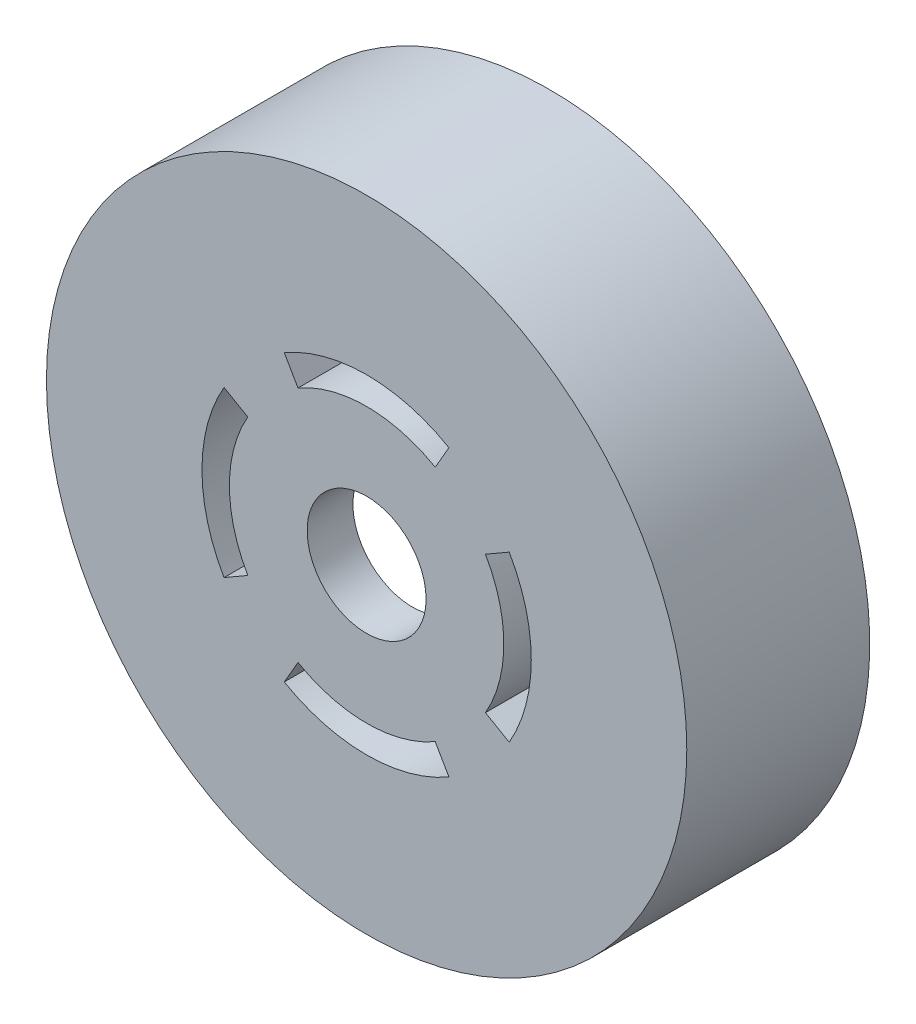
ISO-10303-21;
HEADER;
FILE_DESCRIPTION(('STEP AP214'),'2;1');
FILE_NAME('part.step','',(''),(''),'','','');
FILE_SCHEMA(('AUTOMOTIVE_DESIGN { 1 0 10303 214 1 1 1 1 }'));
ENDSEC;
DATA;
#1=APPLICATION_CONTEXT('core data for automotive mechanical design processes');
#2=APPLICATION_PROTOCOL_DEFINITION('international standard','automotive_design',2000,#1);
#3=PRODUCT_CONTEXT('',#1,'mechanical');
#4=PRODUCT('Part','Part','',(#3));
#5=PRODUCT_RELATED_PRODUCT_CATEGORY('part','',(#4));
#6=PRODUCT_DEFINITION_FORMATION('','',#4);
#7=PRODUCT_DEFINITION_CONTEXT('part definition',#1,'design');
#8=PRODUCT_DEFINITION('design','',#6,#7);
#9=PRODUCT_DEFINITION_SHAPE('','',#8);
#10=(LENGTH_UNIT() NAMED_UNIT(*) SI_UNIT(.MILLI.,.METRE.));
#11=(NAMED_UNIT(*) PLANE_ANGLE_UNIT() SI_UNIT($,.RADIAN.));
#12=(NAMED_UNIT(*) SI_UNIT($,.STERADIAN.) SOLID_ANGLE_UNIT());
#13=UNCERTAINTY_MEASURE_WITH_UNIT(LENGTH_MEASURE(1.E-05),#10,'distance_accuracy_value','');
#14=(GEOMETRIC_REPRESENTATION_CONTEXT(3) GLOBAL_UNCERTAINTY_ASSIGNED_CONTEXT((#13)) GLOBAL_UNIT_ASSIGNED_CONTEXT((#10,
#11,#12)) REPRESENTATION_CONTEXT('',''));
#15=CARTESIAN_POINT('',(0.,0.,0.));
#16=DIRECTION('',(0.,0.,1.));
#17=DIRECTION('',(1.,0.,0.));
#18=AXIS2_PLACEMENT_3D('',#15,#16,#17);
#19=CARTESIAN_POINT('',(0.,0.,0.));
#20=DIRECTION('',(0.,0.,1.));
#21=DIRECTION('',(1.,0.,0.));
#22=AXIS2_PLACEMENT_3D('',#19,#20,#21);
#23=PLANE('',#22);
#24=DIRECTION('',(-0.500000000000002,0.866025403784438,0.));
#25=VECTOR('',#24,1.);
#26=CARTESIAN_POINT('',(-7.50000000000002,12.9903810567666,0.));
#27=LINE('',#26,#25);
#28=CARTESIAN_POINT('',(-7.50000000000003,12.9903810567666,0.));
#29=VERTEX_POINT('',#28);
#30=CARTESIAN_POINT('',(-9.00000000000003,15.5884572681199,0.));
#31=VERTEX_POINT('',#30);
#32=EDGE_CURVE('E219',#29,#31,#27,.T.);
#33=ORIENTED_EDGE('',*,*,#32,.F.);
#34=CARTESIAN_POINT('',(0.,0.,0.));
#35=DIRECTION('',(0.,0.,1.));
#36=DIRECTION('',(-1.,0.,0.));
#37=AXIS2_PLACEMENT_3D('',#34,#35,#36);
#38=CIRCLE('',#37,15.);
#39=CARTESIAN_POINT('',(7.50000000000002,12.9903810567666,0.));
#40=VERTEX_POINT('',#39);
#41=EDGE_CURVE('E61',#40,#29,#38,.T.);
#42=ORIENTED_EDGE('',*,*,#41,.F.);
#43=DIRECTION('',(-0.500000000000001,-0.866025403784438,0.));
#44=VECTOR('',#43,1.);
#45=CARTESIAN_POINT('',(7.50000000000002,12.9903810567666,0.));
#46=LINE('',#45,#44);
#47=CARTESIAN_POINT('',(9.00000000000002,15.5884572681199,0.));
#48=VERTEX_POINT('',#47);
#49=EDGE_CURVE('E206',#48,#40,#46,.T.);
#50=ORIENTED_EDGE('',*,*,#49,.F.);
#51=CARTESIAN_POINT('',(0.,0.,0.));
#52=DIRECTION('',(0.,0.,-1.));
#53=DIRECTION('',(-1.,0.,0.));
#54=AXIS2_PLACEMENT_3D('',#51,#52,#53);
#55=CIRCLE('',#54,18.);
#56=EDGE_CURVE('E210',#31,#48,#55,.T.);
#57=ORIENTED_EDGE('',*,*,#56,.F.);
#58=EDGE_LOOP('',(#33,#42,#50,#57));
#59=FACE_BOUND('',#58,.T.);
#60=DIRECTION('',(-0.866025403784436,-0.500000000000005,0.));
#61=VECTOR('',#60,1.);
#62=CARTESIAN_POINT('',(-12.9903810567665,-7.50000000000007,0.));
#63=LINE('',#62,#61);
#64=CARTESIAN_POINT('',(-12.9903810567665,-7.50000000000007,0.));
#65=VERTEX_POINT('',#64);
#66=CARTESIAN_POINT('',(-15.5884572681199,-9.00000000000008,0.));
#67=VERTEX_POINT('',#66);
#68=EDGE_CURVE('E255',#65,#67,#63,.T.);
#69=ORIENTED_EDGE('',*,*,#68,.F.);
#70=CARTESIAN_POINT('',(0.,0.,0.));
#71=DIRECTION('',(0.,0.,1.));
#72=DIRECTION('',(-1.,0.,0.));
#73=AXIS2_PLACEMENT_3D('',#70,#71,#72);
#74=CIRCLE('',#73,15.);
#75=CARTESIAN_POINT('',(-12.9903810567666,7.49999999999997,0.));
#76=VERTEX_POINT('',#75);
#77=EDGE_CURVE('E69',#76,#65,#74,.T.);
#78=ORIENTED_EDGE('',*,*,#77,.F.);
#79=DIRECTION('',(0.86602540378444,-0.499999999999998,0.));
#80=VECTOR('',#79,1.);
#81=CARTESIAN_POINT('',(-12.9903810567666,7.49999999999997,0.));
#82=LINE('',#81,#80);
#83=CARTESIAN_POINT('',(-15.5884572681199,8.99999999999997,0.));
#84=VERTEX_POINT('',#83);
#85=EDGE_CURVE('E240',#84,#76,#82,.T.);
#86=ORIENTED_EDGE('',*,*,#85,.F.);
#87=CARTESIAN_POINT('',(0.,0.,0.));
#88=DIRECTION('',(0.,0.,-1.));
#89=DIRECTION('',(-1.,0.,0.));
#90=AXIS2_PLACEMENT_3D('',#87,#88,#89);
#91=CIRCLE('',#90,18.);
#92=EDGE_CURVE('E260',#67,#84,#91,.T.);
#93=ORIENTED_EDGE('',*,*,#92,.F.);
#94=EDGE_LOOP('',(#69,#78,#86,#93));
#95=FACE_BOUND('',#94,.T.);
#96=DIRECTION('',(0.500000000000008,-0.866025403784434,0.));
#97=VECTOR('',#96,1.);
#98=CARTESIAN_POINT('',(7.50000000000011,-12.9903810567665,0.));
#99=LINE('',#98,#97);
#100=CARTESIAN_POINT('',(7.50000000000012,-12.9903810567665,0.));
#101=VERTEX_POINT('',#100);
#102=CARTESIAN_POINT('',(9.00000000000013,-15.5884572681198,0.));
#103=VERTEX_POINT('',#102);
#104=EDGE_CURVE('E298',#101,#103,#99,.T.);
#105=ORIENTED_EDGE('',*,*,#104,.F.);
#106=CARTESIAN_POINT('',(0.,0.,0.));
#107=DIRECTION('',(0.,0.,1.));
#108=DIRECTION('',(-1.,0.,0.));
#109=AXIS2_PLACEMENT_3D('',#106,#107,#108);
#110=CIRCLE('',#109,15.);
#111=CARTESIAN_POINT('',(-7.49999999999993,-12.9903810567666,0.));
#112=VERTEX_POINT('',#111);
#113=EDGE_CURVE('E295',#112,#101,#110,.T.);
#114=ORIENTED_EDGE('',*,*,#113,.F.);
#115=DIRECTION('',(0.499999999999995,0.866025403784441,0.));
#116=VECTOR('',#115,1.);
#117=CARTESIAN_POINT('',(-7.49999999999993,-12.9903810567666,0.));
#118=LINE('',#117,#116);
#119=CARTESIAN_POINT('',(-8.99999999999992,-15.5884572681199,0.));
#120=VERTEX_POINT('',#119);
#121=EDGE_CURVE('E282',#120,#112,#118,.T.);
#122=ORIENTED_EDGE('',*,*,#121,.F.);
#123=CARTESIAN_POINT('',(0.,0.,0.));
#124=DIRECTION('',(0.,0.,-1.));
#125=DIRECTION('',(-1.,0.,0.));
#126=AXIS2_PLACEMENT_3D('',#123,#124,#125);
#127=CIRCLE('',#126,18.);
#128=EDGE_CURVE('E303',#103,#120,#127,.T.);
#129=ORIENTED_EDGE('',*,*,#128,.F.);
#130=EDGE_LOOP('',(#105,#114,#122,#129));
#131=FACE_BOUND('',#130,.T.);
#132=DIRECTION('',(0.866025403784432,0.500000000000011,0.));
#133=VECTOR('',#132,1.);
#134=CARTESIAN_POINT('',(12.9903810567665,7.50000000000016,0.));
#135=LINE('',#134,#133);
#136=CARTESIAN_POINT('',(12.9903810567665,7.50000000000016,0.));
#137=VERTEX_POINT('',#136);
#138=CARTESIAN_POINT('',(15.5884572681198,9.0000000000002,0.));
#139=VERTEX_POINT('',#138);
#140=EDGE_CURVE('E342',#137,#139,#135,.T.);
#141=ORIENTED_EDGE('',*,*,#140,.F.);
#142=CARTESIAN_POINT('',(0.,0.,0.));
#143=DIRECTION('',(0.,0.,1.));
#144=DIRECTION('',(-1.,0.,0.));
#145=AXIS2_PLACEMENT_3D('',#142,#143,#144);
#146=CIRCLE('',#145,15.);
#147=CARTESIAN_POINT('',(12.9903810567666,-7.49999999999988,0.));
#148=VERTEX_POINT('',#147);
#149=EDGE_CURVE('E339',#148,#137,#146,.T.);
#150=ORIENTED_EDGE('',*,*,#149,.F.);
#151=DIRECTION('',(-0.866025403784443,0.499999999999992,0.));
#152=VECTOR('',#151,1.);
#153=CARTESIAN_POINT('',(12.9903810567666,-7.49999999999988,0.));
#154=LINE('',#153,#152);
#155=CARTESIAN_POINT('',(15.58845726812,-8.99999999999986,0.));
#156=VERTEX_POINT('',#155);
#157=EDGE_CURVE('E326',#156,#148,#154,.T.);
#158=ORIENTED_EDGE('',*,*,#157,.F.);
#159=CARTESIAN_POINT('',(0.,0.,0.));
#160=DIRECTION('',(0.,0.,-1.));
#161=DIRECTION('',(-1.,0.,0.));
#162=AXIS2_PLACEMENT_3D('',#159,#160,#161);
#163=CIRCLE('',#162,18.);
#164=EDGE_CURVE('E346',#139,#156,#163,.T.);
#165=ORIENTED_EDGE('',*,*,#164,.F.);
#166=EDGE_LOOP('',(#141,#150,#158,#165));
#167=FACE_BOUND('',#166,.T.);
#168=CARTESIAN_POINT('',(0.,0.,0.));
#169=DIRECTION('',(0.,0.,1.));
#170=DIRECTION('',(1.,0.,0.));
#171=AXIS2_PLACEMENT_3D('',#168,#169,#170);
#172=CIRCLE('',#171,6.5);
#173=CARTESIAN_POINT('',(6.5,0.,0.));
#174=VERTEX_POINT('',#173);
#175=EDGE_CURVE('E403',#174,#174,#172,.T.);
#176=ORIENTED_EDGE('',*,*,#175,.T.);
#177=EDGE_LOOP('',(#176));
#178=FACE_BOUND('',#177,.T.);
#179=CARTESIAN_POINT('',(0.,0.,0.));
#180=DIRECTION('',(0.,0.,-1.));
#181=DIRECTION('',(-1.,0.,0.));
#182=AXIS2_PLACEMENT_3D('',#179,#180,#181);
#183=CIRCLE('',#182,30.05);
#184=CARTESIAN_POINT('',(-30.05,0.,0.));
#185=VERTEX_POINT('',#184);
#186=EDGE_CURVE('E368',#185,#185,#183,.T.);
#187=ORIENTED_EDGE('',*,*,#186,.T.);
#188=EDGE_LOOP('',(#187));
#189=FACE_BOUND('',#188,.T.);
#190=ADVANCED_FACE('F39',(#59,#95,#131,#167,#178,#189),#23,.F.);
#191=CARTESIAN_POINT('',(0.,0.,5.));
#192=DIRECTION('',(0.,0.,1.));
#193=DIRECTION('',(1.,0.,0.));
#194=AXIS2_PLACEMENT_3D('',#191,#192,#193);
#195=PLANE('',#194);
#196=CARTESIAN_POINT('',(0.,0.,5.));
#197=DIRECTION('',(0.,0.,1.));
#198=DIRECTION('',(-1.,0.,0.));
#199=AXIS2_PLACEMENT_3D('',#196,#197,#198);
#200=CIRCLE('',#199,15.);
#201=CARTESIAN_POINT('',(7.50000000000002,12.9903810567666,5.));
#202=VERTEX_POINT('',#201);
#203=CARTESIAN_POINT('',(-7.50000000000002,12.9903810567666,5.));
#204=VERTEX_POINT('',#203);
#205=EDGE_CURVE('E184',#202,#204,#200,.T.);
#206=ORIENTED_EDGE('',*,*,#205,.T.);
#207=DIRECTION('',(-0.500000000000002,0.866025403784438,0.));
#208=VECTOR('',#207,1.);
#209=CARTESIAN_POINT('',(-7.50000000000002,12.9903810567666,5.));
#210=LINE('',#209,#208);
#211=CARTESIAN_POINT('',(-9.00000000000003,15.5884572681199,5.));
#212=VERTEX_POINT('',#211);
#213=EDGE_CURVE('E195',#204,#212,#210,.T.);
#214=ORIENTED_EDGE('',*,*,#213,.T.);
#215=CARTESIAN_POINT('',(0.,0.,5.));
#216=DIRECTION('',(0.,0.,-1.));
#217=DIRECTION('',(-1.,0.,0.));
#218=AXIS2_PLACEMENT_3D('',#215,#216,#217);
#219=CIRCLE('',#218,18.);
#220=CARTESIAN_POINT('',(9.00000000000002,15.5884572681199,5.));
#221=VERTEX_POINT('',#220);
#222=EDGE_CURVE('E200',#212,#221,#219,.T.);
#223=ORIENTED_EDGE('',*,*,#222,.T.);
#224=DIRECTION('',(-0.500000000000001,-0.866025403784438,0.));
#225=VECTOR('',#224,1.);
#226=CARTESIAN_POINT('',(7.50000000000002,12.9903810567666,5.));
#227=LINE('',#226,#225);
#228=EDGE_CURVE('E191',#221,#202,#227,.T.);
#229=ORIENTED_EDGE('',*,*,#228,.T.);
#230=EDGE_LOOP('',(#206,#214,#223,#229));
#231=FACE_BOUND('',#230,.T.);
#232=CARTESIAN_POINT('',(0.,0.,5.));
#233=DIRECTION('',(0.,0.,1.));
#234=DIRECTION('',(-1.,0.,0.));
#235=AXIS2_PLACEMENT_3D('',#232,#233,#234);
#236=CIRCLE('',#235,15.);
#237=CARTESIAN_POINT('',(-12.9903810567666,7.49999999999997,5.));
#238=VERTEX_POINT('',#237);
#239=CARTESIAN_POINT('',(-12.9903810567665,-7.50000000000007,5.));
#240=VERTEX_POINT('',#239);
#241=EDGE_CURVE('E235',#238,#240,#236,.T.);
#242=ORIENTED_EDGE('',*,*,#241,.T.);
#243=DIRECTION('',(-0.866025403784436,-0.500000000000005,0.));
#244=VECTOR('',#243,1.);
#245=CARTESIAN_POINT('',(-12.9903810567665,-7.50000000000007,5.));
#246=LINE('',#245,#244);
#247=CARTESIAN_POINT('',(-15.5884572681199,-9.00000000000008,5.));
#248=VERTEX_POINT('',#247);
#249=EDGE_CURVE('E239',#240,#248,#246,.T.);
#250=ORIENTED_EDGE('',*,*,#249,.T.);
#251=CARTESIAN_POINT('',(0.,0.,5.));
#252=DIRECTION('',(0.,0.,-1.));
#253=DIRECTION('',(-1.,0.,0.));
#254=AXIS2_PLACEMENT_3D('',#251,#252,#253);
#255=CIRCLE('',#254,18.);
#256=CARTESIAN_POINT('',(-15.5884572681199,8.99999999999997,5.));
#257=VERTEX_POINT('',#256);
#258=EDGE_CURVE('E244',#248,#257,#255,.T.);
#259=ORIENTED_EDGE('',*,*,#258,.T.);
#260=DIRECTION('',(0.86602540378444,-0.499999999999998,0.));
#261=VECTOR('',#260,1.);
#262=CARTESIAN_POINT('',(-12.9903810567666,7.49999999999997,5.));
#263=LINE('',#262,#261);
#264=EDGE_CURVE('E248',#257,#238,#263,.T.);
#265=ORIENTED_EDGE('',*,*,#264,.T.);
#266=EDGE_LOOP('',(#242,#250,#259,#265));
#267=FACE_BOUND('',#266,.T.);
#268=CARTESIAN_POINT('',(0.,0.,5.));
#269=DIRECTION('',(0.,0.,1.));
#270=DIRECTION('',(-1.,0.,0.));
#271=AXIS2_PLACEMENT_3D('',#268,#269,#270);
#272=CIRCLE('',#271,15.);
#273=CARTESIAN_POINT('',(-7.49999999999993,-12.9903810567666,5.));
#274=VERTEX_POINT('',#273);
#275=CARTESIAN_POINT('',(7.50000000000011,-12.9903810567665,5.));
#276=VERTEX_POINT('',#275);
#277=EDGE_CURVE('E277',#274,#276,#272,.T.);
#278=ORIENTED_EDGE('',*,*,#277,.T.);
#279=DIRECTION('',(0.500000000000008,-0.866025403784434,0.));
#280=VECTOR('',#279,1.);
#281=CARTESIAN_POINT('',(7.50000000000011,-12.9903810567665,5.));
#282=LINE('',#281,#280);
#283=CARTESIAN_POINT('',(9.00000000000014,-15.5884572681198,5.));
#284=VERTEX_POINT('',#283);
#285=EDGE_CURVE('E281',#276,#284,#282,.T.);
#286=ORIENTED_EDGE('',*,*,#285,.T.);
#287=CARTESIAN_POINT('',(0.,0.,5.));
#288=DIRECTION('',(0.,0.,-1.));
#289=DIRECTION('',(-1.,0.,0.));
#290=AXIS2_PLACEMENT_3D('',#287,#288,#289);
#291=CIRCLE('',#290,18.);
#292=CARTESIAN_POINT('',(-8.99999999999992,-15.5884572681199,5.));
#293=VERTEX_POINT('',#292);
#294=EDGE_CURVE('E286',#284,#293,#291,.T.);
#295=ORIENTED_EDGE('',*,*,#294,.T.);
#296=DIRECTION('',(0.499999999999995,0.866025403784441,0.));
#297=VECTOR('',#296,1.);
#298=CARTESIAN_POINT('',(-7.49999999999993,-12.9903810567666,5.));
#299=LINE('',#298,#297);
#300=EDGE_CURVE('E290',#293,#274,#299,.T.);
#301=ORIENTED_EDGE('',*,*,#300,.T.);
#302=EDGE_LOOP('',(#278,#286,#295,#301));
#303=FACE_BOUND('',#302,.T.);
#304=CARTESIAN_POINT('',(0.,0.,5.));
#305=DIRECTION('',(0.,0.,1.));
#306=DIRECTION('',(-1.,0.,0.));
#307=AXIS2_PLACEMENT_3D('',#304,#305,#306);
#308=CIRCLE('',#307,15.);
#309=CARTESIAN_POINT('',(12.9903810567666,-7.49999999999988,5.));
#310=VERTEX_POINT('',#309);
#311=CARTESIAN_POINT('',(12.9903810567665,7.50000000000016,5.));
#312=VERTEX_POINT('',#311);
#313=EDGE_CURVE('E321',#310,#312,#308,.T.);
#314=ORIENTED_EDGE('',*,*,#313,.T.);
#315=DIRECTION('',(0.866025403784432,0.500000000000011,0.));
#316=VECTOR('',#315,1.);
#317=CARTESIAN_POINT('',(12.9903810567665,7.50000000000016,5.));
#318=LINE('',#317,#316);
#319=CARTESIAN_POINT('',(15.5884572681198,9.00000000000019,5.));
#320=VERTEX_POINT('',#319);
#321=EDGE_CURVE('E325',#312,#320,#318,.T.);
#322=ORIENTED_EDGE('',*,*,#321,.T.);
#323=CARTESIAN_POINT('',(0.,0.,5.));
#324=DIRECTION('',(0.,0.,-1.));
#325=DIRECTION('',(-1.,0.,0.));
#326=AXIS2_PLACEMENT_3D('',#323,#324,#325);
#327=CIRCLE('',#326,18.);
#328=CARTESIAN_POINT('',(15.58845726812,-8.99999999999986,5.));
#329=VERTEX_POINT('',#328);
#330=EDGE_CURVE('E330',#320,#329,#327,.T.);
#331=ORIENTED_EDGE('',*,*,#330,.T.);
#332=DIRECTION('',(-0.866025403784443,0.499999999999992,0.));
#333=VECTOR('',#332,1.);
#334=CARTESIAN_POINT('',(12.9903810567666,-7.49999999999988,5.));
#335=LINE('',#334,#333);
#336=EDGE_CURVE('E334',#329,#310,#335,.T.);
#337=ORIENTED_EDGE('',*,*,#336,.T.);
#338=EDGE_LOOP('',(#314,#322,#331,#337));
#339=FACE_BOUND('',#338,.T.);
#340=CARTESIAN_POINT('',(0.,0.,5.));
#341=DIRECTION('',(0.,0.,1.));
#342=DIRECTION('',(1.,0.,0.));
#343=AXIS2_PLACEMENT_3D('',#340,#341,#342);
#344=CIRCLE('',#343,35.);
#345=CARTESIAN_POINT('',(35.,0.,5.));
#346=VERTEX_POINT('',#345);
#347=EDGE_CURVE('E408',#346,#346,#344,.T.);
#348=ORIENTED_EDGE('',*,*,#347,.T.);
#349=EDGE_LOOP('',(#348));
#350=FACE_BOUND('',#349,.T.);
#351=CARTESIAN_POINT('',(0.,0.,5.));
#352=DIRECTION('',(0.,0.,1.));
#353=DIRECTION('',(1.,0.,0.));
#354=AXIS2_PLACEMENT_3D('',#351,#352,#353);
#355=CIRCLE('',#354,6.5);
#356=CARTESIAN_POINT('',(6.5,0.,5.));
#357=VERTEX_POINT('',#356);
#358=EDGE_CURVE('E404',#357,#357,#355,.T.);
#359=ORIENTED_EDGE('',*,*,#358,.F.);
#360=EDGE_LOOP('',(#359));
#361=FACE_BOUND('',#360,.T.);
#362=ADVANCED_FACE('F202',(#231,#267,#303,#339,#350,#361),#195,.T.);
#363=CARTESIAN_POINT('',(0.,0.,5.));
#364=DIRECTION('',(0.,0.,-1.));
#365=DIRECTION('',(-1.,0.,0.));
#366=AXIS2_PLACEMENT_3D('',#363,#364,#365);
#367=CYLINDRICAL_SURFACE('',#366,35.);
#368=ORIENTED_EDGE('',*,*,#347,.F.);
#369=EDGE_LOOP('',(#368));
#370=FACE_BOUND('',#369,.T.);
#371=CARTESIAN_POINT('',(0.,0.,-15.));
#372=DIRECTION('',(0.,0.,-1.));
#373=DIRECTION('',(-1.,0.,0.));
#374=AXIS2_PLACEMENT_3D('',#371,#372,#373);
#375=CIRCLE('',#374,35.);
#376=CARTESIAN_POINT('',(-35.,0.,-15.));
#377=VERTEX_POINT('',#376);
#378=EDGE_CURVE('E399',#377,#377,#375,.T.);
#379=ORIENTED_EDGE('',*,*,#378,.F.);
#380=EDGE_LOOP('',(#379));
#381=FACE_BOUND('',#380,.T.);
#382=ADVANCED_FACE('F464',(#370,#381),#367,.T.);
#383=CARTESIAN_POINT('',(0.,0.,5.));
#384=DIRECTION('',(0.,0.,-1.));
#385=DIRECTION('',(-1.,0.,0.));
#386=AXIS2_PLACEMENT_3D('',#383,#384,#385);
#387=CYLINDRICAL_SURFACE('',#386,6.5);
#388=ORIENTED_EDGE('',*,*,#358,.T.);
#389=EDGE_LOOP('',(#388));
#390=FACE_BOUND('',#389,.T.);
#391=ORIENTED_EDGE('',*,*,#175,.F.);
#392=EDGE_LOOP('',(#391));
#393=FACE_BOUND('',#392,.T.);
#394=ADVANCED_FACE('F460',(#390,#393),#387,.F.);
#395=CARTESIAN_POINT('',(0.,0.,-15.));
#396=DIRECTION('',(0.,0.,-1.));
#397=DIRECTION('',(-1.,0.,0.));
#398=AXIS2_PLACEMENT_3D('',#395,#396,#397);
#399=PLANE('',#398);
#400=CARTESIAN_POINT('',(-1.83547080668457E-12,-32.5,-15.));
#401=DIRECTION('',(0.,0.,-1.));
#402=DIRECTION('',(-1.,0.,0.));
#403=AXIS2_PLACEMENT_3D('',#400,#401,#402);
#404=CIRCLE('',#403,1.55000000000197);
#405=CARTESIAN_POINT('',(0.535344826111361,-31.0453846153846,-15.));
#406=VERTEX_POINT('',#405);
#407=CARTESIAN_POINT('',(-0.535344826114868,-31.0453846153845,-15.));
#408=VERTEX_POINT('',#407);
#409=EDGE_CURVE('E385',#406,#408,#404,.T.);
#410=ORIENTED_EDGE('',*,*,#409,.F.);
#411=CARTESIAN_POINT('',(0.,0.,-15.));
#412=DIRECTION('',(0.,0.,-1.));
#413=DIRECTION('',(-1.,0.,0.));
#414=AXIS2_PLACEMENT_3D('',#411,#412,#413);
#415=CIRCLE('',#414,31.05);
#416=CARTESIAN_POINT('',(31.0453846153845,-0.535344826114989,-15.));
#417=VERTEX_POINT('',#416);
#418=EDGE_CURVE('E428',#406,#417,#415,.F.);
#419=ORIENTED_EDGE('',*,*,#418,.T.);
#420=CARTESIAN_POINT('',(32.4999999999991,-9.21715505439516E-13,-15.));
#421=DIRECTION('',(0.,0.,-1.));
#422=DIRECTION('',(-1.,0.,0.));
#423=AXIS2_PLACEMENT_3D('',#420,#421,#422);
#424=CIRCLE('',#423,1.55000000000148);
#425=CARTESIAN_POINT('',(31.0453846153845,0.535344826113227,-15.));
#426=VERTEX_POINT('',#425);
#427=EDGE_CURVE('E229',#426,#417,#424,.T.);
#428=ORIENTED_EDGE('',*,*,#427,.F.);
#429=CARTESIAN_POINT('',(0.,0.,-15.));
#430=DIRECTION('',(0.,0.,-1.));
#431=DIRECTION('',(-1.,0.,0.));
#432=AXIS2_PLACEMENT_3D('',#429,#430,#431);
#433=CIRCLE('',#432,31.05);
#434=CARTESIAN_POINT('',(0.535344826107665,31.0453846153846,-15.));
#435=VERTEX_POINT('',#434);
#436=EDGE_CURVE('E425',#426,#435,#433,.F.);
#437=ORIENTED_EDGE('',*,*,#436,.T.);
#438=CARTESIAN_POINT('',(0.,32.5,-15.));
#439=DIRECTION('',(0.,0.,-1.));
#440=DIRECTION('',(-1.,0.,0.));
#441=AXIS2_PLACEMENT_3D('',#438,#439,#440);
#442=CIRCLE('',#441,1.55);
#443=CARTESIAN_POINT('',(-0.535344826107665,31.0453846153846,-15.));
#444=VERTEX_POINT('',#443);
#445=EDGE_CURVE('E369',#444,#435,#442,.T.);
#446=ORIENTED_EDGE('',*,*,#445,.F.);
#447=CARTESIAN_POINT('',(0.,0.,-15.));
#448=DIRECTION('',(0.,0.,-1.));
#449=DIRECTION('',(-1.,0.,0.));
#450=AXIS2_PLACEMENT_3D('',#447,#448,#449);
#451=CIRCLE('',#450,31.05);
#452=CARTESIAN_POINT('',(-31.0453846153846,0.535344826108146,-15.));
#453=VERTEX_POINT('',#452);
#454=EDGE_CURVE('E422',#444,#453,#451,.F.);
#455=ORIENTED_EDGE('',*,*,#454,.T.);
#456=CARTESIAN_POINT('',(-32.5000000000009,9.17735403342287E-13,-15.));
#457=DIRECTION('',(0.,0.,-1.));
#458=DIRECTION('',(-1.,0.,0.));
#459=AXIS2_PLACEMENT_3D('',#456,#457,#458);
#460=CIRCLE('',#459,1.55000000000072);
#461=CARTESIAN_POINT('',(-31.0453846153846,-0.535344826106392,-15.));
#462=VERTEX_POINT('',#461);
#463=EDGE_CURVE('E377',#462,#453,#460,.T.);
#464=ORIENTED_EDGE('',*,*,#463,.F.);
#465=CARTESIAN_POINT('',(0.,0.,-15.));
#466=DIRECTION('',(0.,0.,-1.));
#467=DIRECTION('',(-1.,0.,0.));
#468=AXIS2_PLACEMENT_3D('',#465,#466,#467);
#469=CIRCLE('',#468,31.05);
#470=EDGE_CURVE('E419',#462,#408,#469,.F.);
#471=ORIENTED_EDGE('',*,*,#470,.T.);
#472=EDGE_LOOP('',(#410,#419,#428,#437,#446,#455,#464,#471));
#473=FACE_BOUND('',#472,.T.);
#474=ORIENTED_EDGE('',*,*,#378,.T.);
#475=EDGE_LOOP('',(#474));
#476=FACE_BOUND('',#475,.T.);
#477=ADVANCED_FACE('F456',(#473,#476),#399,.T.);
#478=CARTESIAN_POINT('',(0.,0.,-15.));
#479=DIRECTION('',(0.,0.,1.));
#480=DIRECTION('',(1.,0.,0.));
#481=AXIS2_PLACEMENT_3D('',#478,#479,#480);
#482=CYLINDRICAL_SURFACE('',#481,30.05);
#483=CARTESIAN_POINT('',(0.,0.,-14.));
#484=DIRECTION('',(0.,0.,-1.));
#485=DIRECTION('',(-1.,0.,0.));
#486=AXIS2_PLACEMENT_3D('',#483,#484,#485);
#487=CIRCLE('',#486,30.05);
#488=CARTESIAN_POINT('',(-30.05,0.,-14.));
#489=VERTEX_POINT('',#488);
#490=EDGE_CURVE('E415',#489,#489,#487,.T.);
#491=ORIENTED_EDGE('',*,*,#490,.T.);
#492=EDGE_LOOP('',(#491));
#493=FACE_BOUND('',#492,.T.);
#494=ORIENTED_EDGE('',*,*,#186,.F.);
#495=EDGE_LOOP('',(#494));
#496=FACE_BOUND('',#495,.T.);
#497=ADVANCED_FACE('F452',(#493,#496),#482,.F.);
#498=CARTESIAN_POINT('',(32.4999999999991,-9.21715505439516E-13,-5.));
#499=DIRECTION('',(0.,0.,-1.));
#500=DIRECTION('',(-1.,0.,0.));
#501=AXIS2_PLACEMENT_3D('',#498,#499,#500);
#502=CYLINDRICAL_SURFACE('',#501,1.55000000000148);
#503=CARTESIAN_POINT('',(32.4999999999991,-9.21715505439516E-13,-5.));
#504=DIRECTION('',(0.,0.,-1.));
#505=DIRECTION('',(-1.,0.,0.));
#506=AXIS2_PLACEMENT_3D('',#503,#504,#505);
#507=CIRCLE('',#506,1.55000000000148);
#508=CARTESIAN_POINT('',(30.9499999999976,-9.21715505439516E-13,-5.));
#509=VERTEX_POINT('',#508);
#510=EDGE_CURVE('E389',#509,#509,#507,.T.);
#511=ORIENTED_EDGE('',*,*,#510,.F.);
#512=EDGE_LOOP('',(#511));
#513=FACE_BOUND('',#512,.T.);
#514=ORIENTED_EDGE('',*,*,#427,.T.);
#515=CARTESIAN_POINT('',(31.0453846153845,-0.535344826114989,-15.));
#516=CARTESIAN_POINT('',(31.0307383869997,-0.495560014249698,-14.9999826692012));
#517=CARTESIAN_POINT('',(31.0177330548798,-0.455175578224388,-14.9996467246057));
#518=CARTESIAN_POINT('',(30.9950725448644,-0.373479727093672,-14.9986855686351));
#519=CARTESIAN_POINT('',(30.9854174143775,-0.332168298879239,-14.9980603531668));
#520=CARTESIAN_POINT('',(30.9695129884534,-0.248823229093558,-14.9968676541164));
#521=CARTESIAN_POINT('',(30.9632693341293,-0.206788509158926,-14.9963002674104));
#522=CARTESIAN_POINT('',(30.9542530788073,-0.122349646109064,-14.9954377750089));
#523=CARTESIAN_POINT('',(30.9514802497615,-0.0799455274492649,-14.9951426514248));
#524=CARTESIAN_POINT('',(30.9494000413959,0.0060660291117783,-14.9949249184645));
#525=CARTESIAN_POINT('',(30.9501853162059,0.0496758985104902,-14.9950122668137));
#526=CARTESIAN_POINT('',(30.955420862965,0.136675617082505,-14.9955454461856));
#527=CARTESIAN_POINT('',(30.9598731005956,0.180065335689092,-14.9959914694736));
#528=CARTESIAN_POINT('',(30.9786772411035,0.309192574073585,-14.9976518800101));
#529=CARTESIAN_POINT('',(30.9984681568341,0.394247749436495,-14.9991895872164));
#530=CARTESIAN_POINT('',(31.0283519271968,0.486682209622534,-14.9998458579856));
#531=CARTESIAN_POINT('',(31.031623661036,0.496465468483389,-14.9999021305463));
#532=CARTESIAN_POINT('',(31.0383595917298,0.515958287580456,-14.9999794862789));
#533=CARTESIAN_POINT('',(31.0418236578275,0.525667892907062,-15.0000005930627));
#534=CARTESIAN_POINT('',(31.0453846153845,0.535344826113227,-15.));
#535=B_SPLINE_CURVE_WITH_KNOTS('',3,(#515,#516,#517,#518,#519,#520,#521,#522,#523,#524,#525,
#526,#527,#528,#529,#530,#531,#532,#533,#534),.UNSPECIFIED.,.F.,.F.,(4,2,2,2,2,2,2,2,2,4),(0.,
0.127143058476894,0.254287916077298,0.381642385130178,0.508988486014026,0.639669501712304,
0.770420614814959,1.03085621097554,1.06180485262347,1.09273270553381),.UNSPECIFIED.);
#536=EDGE_CURVE('E432',#417,#426,#535,.T.);
#537=ORIENTED_EDGE('',*,*,#536,.T.);
#538=EDGE_LOOP('',(#514,#537));
#539=FACE_BOUND('',#538,.T.);
#540=ADVANCED_FACE('F446',(#513,#539),#502,.F.);
#541=CARTESIAN_POINT('',(0.,0.,-5.));
#542=DIRECTION('',(0.,0.,-1.));
#543=DIRECTION('',(-1.,0.,0.));
#544=AXIS2_PLACEMENT_3D('',#541,#542,#543);
#545=PLANE('',#544);
#546=ORIENTED_EDGE('',*,*,#510,.T.);
#547=EDGE_LOOP('',(#546));
#548=FACE_BOUND('',#547,.T.);
#549=ADVANCED_FACE('F451',(#548),#545,.T.);
#550=CARTESIAN_POINT('',(-1.83547080668457E-12,-32.5,-5.));
#551=DIRECTION('',(0.,0.,-1.));
#552=DIRECTION('',(-1.,0.,0.));
#553=AXIS2_PLACEMENT_3D('',#550,#551,#552);
#554=CYLINDRICAL_SURFACE('',#553,1.55000000000197);
#555=CARTESIAN_POINT('',(-1.83547080668457E-12,-32.5,-5.));
#556=DIRECTION('',(0.,0.,-1.));
#557=DIRECTION('',(-1.,0.,0.));
#558=AXIS2_PLACEMENT_3D('',#555,#556,#557);
#559=CIRCLE('',#558,1.55000000000197);
#560=CARTESIAN_POINT('',(-1.55000000000381,-32.5,-5.));
#561=VERTEX_POINT('',#560);
#562=EDGE_CURVE('E381',#561,#561,#559,.T.);
#563=ORIENTED_EDGE('',*,*,#562,.F.);
#564=EDGE_LOOP('',(#563));
#565=FACE_BOUND('',#564,.T.);
#566=ORIENTED_EDGE('',*,*,#409,.T.);
#567=CARTESIAN_POINT('',(-0.535344826114868,-31.0453846153845,-15.));
#568=CARTESIAN_POINT('',(-0.495560014249567,-31.0307383869997,-14.9999826692012));
#569=CARTESIAN_POINT('',(-0.455175578224248,-31.0177330548798,-14.9996467246057));
#570=CARTESIAN_POINT('',(-0.373479727093517,-30.9950725448645,-14.9986855686351));
#571=CARTESIAN_POINT('',(-0.332168298879077,-30.9854174143776,-14.9980603531668));
#572=CARTESIAN_POINT('',(-0.248823229093384,-30.9695129884536,-14.9968676541164));
#573=CARTESIAN_POINT('',(-0.206788509158747,-30.9632693341296,-14.9963002674105));
#574=CARTESIAN_POINT('',(-0.122349646108877,-30.9542530788077,-14.995437775009));
#575=CARTESIAN_POINT('',(-0.0799455274490759,-30.9514802497618,-14.9951426514248));
#576=CARTESIAN_POINT('',(0.00606602911198425,-30.9494000413963,-14.9949249184646));
#577=CARTESIAN_POINT('',(0.0496758985107106,-30.9501853162063,-14.9950122668138));
#578=CARTESIAN_POINT('',(0.136675617082752,-30.9554208629655,-14.9955454461857));
#579=CARTESIAN_POINT('',(0.180065335689351,-30.9598731005961,-14.9959914694736));
#580=CARTESIAN_POINT('',(0.309192574073874,-30.9786772411041,-14.9976518800101));
#581=CARTESIAN_POINT('',(0.3942477494368,-30.9984681568348,-14.9991895872165));
#582=CARTESIAN_POINT('',(0.486682209622474,-31.0283519271975,-14.9998458579856));
#583=CARTESIAN_POINT('',(0.496465468482963,-31.0316236610365,-14.9999021305463));
#584=CARTESIAN_POINT('',(0.515958287579305,-31.0383595917301,-14.9999794862789));
#585=CARTESIAN_POINT('',(0.525667892905552,-31.0418236578277,-15.0000005930627));
#586=CARTESIAN_POINT('',(0.535344826111361,-31.0453846153846,-15.));
#587=B_SPLINE_CURVE_WITH_KNOTS('',3,(#567,#568,#569,#570,#571,#572,#573,#574,#575,#576,#577,
#578,#579,#580,#581,#582,#583,#584,#585,#586),.UNSPECIFIED.,.F.,.F.,(4,2,2,2,2,2,2,2,2,4),(0.,
0.127143058476888,0.254287916077288,0.38164238513017,0.508988486014019,0.639669501712342,
0.770420614815043,1.03085621097571,1.06180485262248,1.09273270553168),.UNSPECIFIED.);
#588=EDGE_CURVE('E11',#408,#406,#587,.T.);
#589=ORIENTED_EDGE('',*,*,#588,.T.);
#590=EDGE_LOOP('',(#566,#589));
#591=FACE_BOUND('',#590,.T.);
#592=ADVANCED_FACE('F513',(#565,#591),#554,.F.);
#593=CARTESIAN_POINT('',(0.,0.,-5.));
#594=DIRECTION('',(0.,0.,-1.));
#595=DIRECTION('',(-1.,0.,0.));
#596=AXIS2_PLACEMENT_3D('',#593,#594,#595);
#597=PLANE('',#596);
#598=ORIENTED_EDGE('',*,*,#562,.T.);
#599=EDGE_LOOP('',(#598));
#600=FACE_BOUND('',#599,.T.);
#601=ADVANCED_FACE('F520',(#600),#597,.T.);
#602=CARTESIAN_POINT('',(-32.5000000000009,9.17735403342287E-13,-5.));
#603=DIRECTION('',(0.,0.,-1.));
#604=DIRECTION('',(-1.,0.,0.));
#605=AXIS2_PLACEMENT_3D('',#602,#603,#604);
#606=CYLINDRICAL_SURFACE('',#605,1.55000000000072);
#607=CARTESIAN_POINT('',(-32.5000000000009,9.17735403342287E-13,-5.));
#608=DIRECTION('',(0.,0.,-1.));
#609=DIRECTION('',(-1.,0.,0.));
#610=AXIS2_PLACEMENT_3D('',#607,#608,#609);
#611=CIRCLE('',#610,1.55000000000072);
#612=CARTESIAN_POINT('',(-34.0500000000016,9.17735403342287E-13,-5.));
#613=VERTEX_POINT('',#612);
#614=EDGE_CURVE('E373',#613,#613,#611,.T.);
#615=ORIENTED_EDGE('',*,*,#614,.F.);
#616=EDGE_LOOP('',(#615));
#617=FACE_BOUND('',#616,.T.);
#618=ORIENTED_EDGE('',*,*,#463,.T.);
#619=CARTESIAN_POINT('',(-31.0453846153846,0.535344826108146,-15.));
#620=CARTESIAN_POINT('',(-31.030738387,0.495560014242792,-14.9999826692012));
#621=CARTESIAN_POINT('',(-31.0177330548802,0.455175578217426,-14.9996467246057));
#622=CARTESIAN_POINT('',(-30.9950725448652,0.373479727086611,-14.9986855686351));
#623=CARTESIAN_POINT('',(-30.9854174143785,0.332168298872136,-14.9980603531669));
#624=CARTESIAN_POINT('',(-30.9695129884548,0.24882322908638,-14.9968676541165));
#625=CARTESIAN_POINT('',(-30.9632693341309,0.206788509151715,-14.9963002674106));
#626=CARTESIAN_POINT('',(-30.9542530788094,0.122349646101802,-14.9954377750091));
#627=CARTESIAN_POINT('',(-30.9514802497637,0.0799455274419859,-14.995142651425));
#628=CARTESIAN_POINT('',(-30.9494000413985,-0.0060660291190561,-14.9949249184648));
#629=CARTESIAN_POINT('',(-30.9501853162087,-0.0496758985177488,-14.995012266814));
#630=CARTESIAN_POINT('',(-30.9554208629682,-0.136675617089709,-14.995545446186));
#631=CARTESIAN_POINT('',(-30.959873100599,-0.180065335696259,-14.9959914694739));
#632=CARTESIAN_POINT('',(-30.9786772411075,-0.309192574080607,-14.9976518800104));
#633=CARTESIAN_POINT('',(-30.9984681568385,-0.394247749443387,-14.9991895872167));
#634=CARTESIAN_POINT('',(-31.028351927201,-0.486682209626963,-14.9998458579857));
#635=CARTESIAN_POINT('',(-31.0316236610393,-0.496465468485542,-14.9999021305463));
#636=CARTESIAN_POINT('',(-31.0383595917316,-0.51595828757809,-14.9999794862789));
#637=CARTESIAN_POINT('',(-31.0418236578285,-0.525667892902453,-15.0000005930627));
#638=CARTESIAN_POINT('',(-31.0453846153846,-0.535344826106392,-15.));
#639=B_SPLINE_CURVE_WITH_KNOTS('',3,(#619,#620,#621,#622,#623,#624,#625,#626,#627,#628,#629,
#630,#631,#632,#633,#634,#635,#636,#637,#638),.UNSPECIFIED.,.F.,.F.,(4,2,2,2,2,2,2,2,2,4),(0.,
0.127143058476885,0.25428791607728,0.381642385130173,0.508988486014034,0.639669501712265,
0.770420614814874,1.03085621097532,1.06180485261608,1.09273270551925),.UNSPECIFIED.);
#640=EDGE_CURVE('E54',#453,#462,#639,.T.);
#641=ORIENTED_EDGE('',*,*,#640,.T.);
#642=EDGE_LOOP('',(#618,#641));
#643=FACE_BOUND('',#642,.T.);
#644=ADVANCED_FACE('F527',(#617,#643),#606,.F.);
#645=CARTESIAN_POINT('',(0.,0.,-5.));
#646=DIRECTION('',(0.,0.,-1.));
#647=DIRECTION('',(-1.,0.,0.));
#648=AXIS2_PLACEMENT_3D('',#645,#646,#647);
#649=PLANE('',#648);
#650=ORIENTED_EDGE('',*,*,#614,.T.);
#651=EDGE_LOOP('',(#650));
#652=FACE_BOUND('',#651,.T.);
#653=ADVANCED_FACE('F535',(#652),#649,.T.);
#654=CARTESIAN_POINT('',(0.,32.5,-5.));
#655=DIRECTION('',(0.,0.,-1.));
#656=DIRECTION('',(-1.,0.,0.));
#657=AXIS2_PLACEMENT_3D('',#654,#655,#656);
#658=CYLINDRICAL_SURFACE('',#657,1.55);
#659=CARTESIAN_POINT('',(0.,32.5,-5.));
#660=DIRECTION('',(0.,0.,-1.));
#661=DIRECTION('',(-1.,0.,0.));
#662=AXIS2_PLACEMENT_3D('',#659,#660,#661);
#663=CIRCLE('',#662,1.55);
#664=CARTESIAN_POINT('',(-1.55,32.5,-5.));
#665=VERTEX_POINT('',#664);
#666=EDGE_CURVE('E364',#665,#665,#663,.T.);
#667=ORIENTED_EDGE('',*,*,#666,.F.);
#668=EDGE_LOOP('',(#667));
#669=FACE_BOUND('',#668,.T.);
#670=ORIENTED_EDGE('',*,*,#445,.T.);
#671=CARTESIAN_POINT('',(0.535344826107665,31.0453846153846,-15.));
#672=CARTESIAN_POINT('',(0.495560014242317,31.030738387,-14.9999826692012));
#673=CARTESIAN_POINT('',(0.455175578216956,31.0177330548802,-14.9996467246057));
#674=CARTESIAN_POINT('',(0.37347972708615,30.9950725448652,-14.9986855686351));
#675=CARTESIAN_POINT('',(0.332168298871678,30.9854174143784,-14.9980603531669));
#676=CARTESIAN_POINT('',(0.248823229085926,30.9695129884547,-14.9968676541165));
#677=CARTESIAN_POINT('',(0.206788509151263,30.9632693341308,-14.9963002674106));
#678=CARTESIAN_POINT('',(0.122349646101351,30.9542530788092,-14.9954377750091));
#679=CARTESIAN_POINT('',(0.0799455274415355,30.9514802497635,-14.995142651425));
#680=CARTESIAN_POINT('',(-0.00606602911948541,30.9494000413983,-14.9949249184648));
#681=CARTESIAN_POINT('',(-0.0496758985181575,30.9501853162085,-14.995012266814));
#682=CARTESIAN_POINT('',(-0.136675617090077,30.9554208629679,-14.9955454461859));
#683=CARTESIAN_POINT('',(-0.180065335696609,30.9598731005987,-14.9959914694739));
#684=CARTESIAN_POINT('',(-0.309192574080903,30.9786772411072,-14.9976518800103));
#685=CARTESIAN_POINT('',(-0.394247749443649,30.9984681568381,-14.9991895872166));
#686=CARTESIAN_POINT('',(-0.486682209627371,31.0283519272006,-14.9998458579857));
#687=CARTESIAN_POINT('',(-0.496465468486124,31.0316236610391,-14.9999021305463));
#688=CARTESIAN_POINT('',(-0.51595828757902,31.0383595917314,-14.9999794862789));
#689=CARTESIAN_POINT('',(-0.525667892903556,31.0418236578284,-15.0000005930627));
#690=CARTESIAN_POINT('',(-0.535344826107666,31.0453846153846,-15.));
#691=B_SPLINE_CURVE_WITH_KNOTS('',3,(#671,#672,#673,#674,#675,#676,#677,#678,#679,#680,#681,
#682,#683,#684,#685,#686,#687,#688,#689,#690),.UNSPECIFIED.,.F.,.F.,(4,2,2,2,2,2,2,2,2,4),(0.,
0.127143058476887,0.254287916077287,0.381642385130181,0.508988486014043,0.639669501712212,
0.770420614814759,1.03085621097509,1.0618048526164,1.09273270552012),.UNSPECIFIED.);
#692=EDGE_CURVE('E440',#435,#444,#691,.T.);
#693=ORIENTED_EDGE('',*,*,#692,.T.);
#694=EDGE_LOOP('',(#670,#693));
#695=FACE_BOUND('',#694,.T.);
#696=ADVANCED_FACE('F543',(#669,#695),#658,.F.);
#697=CARTESIAN_POINT('',(0.,0.,-5.));
#698=DIRECTION('',(0.,0.,-1.));
#699=DIRECTION('',(-1.,0.,0.));
#700=AXIS2_PLACEMENT_3D('',#697,#698,#699);
#701=PLANE('',#700);
#702=ORIENTED_EDGE('',*,*,#666,.T.);
#703=EDGE_LOOP('',(#702));
#704=FACE_BOUND('',#703,.T.);
#705=ADVANCED_FACE('F550',(#704),#701,.T.);
#706=CARTESIAN_POINT('',(0.,0.,-14.));
#707=DIRECTION('',(0.,0.,-1.));
#708=DIRECTION('',(-1.,0.,0.));
#709=AXIS2_PLACEMENT_3D('',#706,#707,#708);
#710=TOROIDAL_SURFACE('',#709,31.05,1.);
#711=ORIENTED_EDGE('',*,*,#536,.F.);
#712=ORIENTED_EDGE('',*,*,#418,.F.);
#713=ORIENTED_EDGE('',*,*,#588,.F.);
#714=ORIENTED_EDGE('',*,*,#470,.F.);
#715=ORIENTED_EDGE('',*,*,#640,.F.);
#716=ORIENTED_EDGE('',*,*,#454,.F.);
#717=ORIENTED_EDGE('',*,*,#692,.F.);
#718=ORIENTED_EDGE('',*,*,#436,.F.);
#719=EDGE_LOOP('',(#711,#712,#713,#714,#715,#716,#717,#718));
#720=FACE_BOUND('',#719,.T.);
#721=ORIENTED_EDGE('',*,*,#490,.F.);
#722=EDGE_LOOP('',(#721));
#723=FACE_BOUND('',#722,.T.);
#724=ADVANCED_FACE('F41',(#720,#723),#710,.T.);
#725=CARTESIAN_POINT('',(0.,0.,5.));
#726=DIRECTION('',(0.,0.,-1.));
#727=DIRECTION('',(-1.,0.,0.));
#728=AXIS2_PLACEMENT_3D('',#725,#726,#727);
#729=CYLINDRICAL_SURFACE('',#728,15.);
#730=ORIENTED_EDGE('',*,*,#149,.T.);
#731=DIRECTION('',(0.,0.,-1.));
#732=VECTOR('',#731,1.);
#733=CARTESIAN_POINT('',(12.9903810567665,7.50000000000016,5.));
#734=LINE('',#733,#732);
#735=EDGE_CURVE('E338',#312,#137,#734,.T.);
#736=ORIENTED_EDGE('',*,*,#735,.F.);
#737=ORIENTED_EDGE('',*,*,#313,.F.);
#738=DIRECTION('',(0.,0.,-1.));
#739=VECTOR('',#738,1.);
#740=CARTESIAN_POINT('',(12.9903810567666,-7.49999999999988,5.));
#741=LINE('',#740,#739);
#742=EDGE_CURVE('E299',#310,#148,#741,.T.);
#743=ORIENTED_EDGE('',*,*,#742,.T.);
#744=EDGE_LOOP('',(#730,#736,#737,#743));
#745=FACE_BOUND('',#744,.T.);
#746=ADVANCED_FACE('F563',(#745),#729,.T.);
#747=CARTESIAN_POINT('',(12.9903810567666,-7.49999999999988,5.));
#748=DIRECTION('',(-0.499999999999992,-0.866025403784443,0.));
#749=DIRECTION('',(0.866025403784443,-0.499999999999992,0.));
#750=AXIS2_PLACEMENT_3D('',#747,#748,#749);
#751=PLANE('',#750);
#752=ORIENTED_EDGE('',*,*,#157,.T.);
#753=ORIENTED_EDGE('',*,*,#742,.F.);
#754=ORIENTED_EDGE('',*,*,#336,.F.);
#755=DIRECTION('',(0.,0.,-1.));
#756=VECTOR('',#755,1.);
#757=CARTESIAN_POINT('',(15.58845726812,-8.99999999999986,5.));
#758=LINE('',#757,#756);
#759=EDGE_CURVE('E355',#329,#156,#758,.T.);
#760=ORIENTED_EDGE('',*,*,#759,.T.);
#761=EDGE_LOOP('',(#752,#753,#754,#760));
#762=FACE_BOUND('',#761,.T.);
#763=ADVANCED_FACE('F571',(#762),#751,.F.);
#764=CARTESIAN_POINT('',(0.,0.,5.));
#765=DIRECTION('',(0.,0.,-1.));
#766=DIRECTION('',(-1.,0.,0.));
#767=AXIS2_PLACEMENT_3D('',#764,#765,#766);
#768=CYLINDRICAL_SURFACE('',#767,18.);
#769=ORIENTED_EDGE('',*,*,#164,.T.);
#770=ORIENTED_EDGE('',*,*,#759,.F.);
#771=ORIENTED_EDGE('',*,*,#330,.F.);
#772=DIRECTION('',(0.,0.,-1.));
#773=VECTOR('',#772,1.);
#774=CARTESIAN_POINT('',(15.5884572681198,9.0000000000002,5.));
#775=LINE('',#774,#773);
#776=EDGE_CURVE('E358',#320,#139,#775,.T.);
#777=ORIENTED_EDGE('',*,*,#776,.T.);
#778=EDGE_LOOP('',(#769,#770,#771,#777));
#779=FACE_BOUND('',#778,.T.);
#780=ADVANCED_FACE('F579',(#779),#768,.F.);
#781=CARTESIAN_POINT('',(12.9903810567665,7.50000000000016,5.));
#782=DIRECTION('',(-0.500000000000011,0.866025403784432,0.));
#783=DIRECTION('',(-0.866025403784432,-0.500000000000011,0.));
#784=AXIS2_PLACEMENT_3D('',#781,#782,#783);
#785=PLANE('',#784);
#786=ORIENTED_EDGE('',*,*,#140,.T.);
#787=ORIENTED_EDGE('',*,*,#776,.F.);
#788=ORIENTED_EDGE('',*,*,#321,.F.);
#789=ORIENTED_EDGE('',*,*,#735,.T.);
#790=EDGE_LOOP('',(#786,#787,#788,#789));
#791=FACE_BOUND('',#790,.T.);
#792=ADVANCED_FACE('F587',(#791),#785,.F.);
#793=CARTESIAN_POINT('',(0.,0.,5.));
#794=DIRECTION('',(0.,0.,-1.));
#795=DIRECTION('',(-1.,0.,0.));
#796=AXIS2_PLACEMENT_3D('',#793,#794,#795);
#797=CYLINDRICAL_SURFACE('',#796,15.);
#798=ORIENTED_EDGE('',*,*,#113,.T.);
#799=DIRECTION('',(0.,0.,-1.));
#800=VECTOR('',#799,1.);
#801=CARTESIAN_POINT('',(7.50000000000011,-12.9903810567665,5.));
#802=LINE('',#801,#800);
#803=EDGE_CURVE('E294',#276,#101,#802,.T.);
#804=ORIENTED_EDGE('',*,*,#803,.F.);
#805=ORIENTED_EDGE('',*,*,#277,.F.);
#806=DIRECTION('',(0.,0.,-1.));
#807=VECTOR('',#806,1.);
#808=CARTESIAN_POINT('',(-7.49999999999993,-12.9903810567666,5.));
#809=LINE('',#808,#807);
#810=EDGE_CURVE('E256',#274,#112,#809,.T.);
#811=ORIENTED_EDGE('',*,*,#810,.T.);
#812=EDGE_LOOP('',(#798,#804,#805,#811));
#813=FACE_BOUND('',#812,.T.);
#814=ADVANCED_FACE('F595',(#813),#797,.T.);
#815=CARTESIAN_POINT('',(-7.49999999999993,-12.9903810567666,5.));
#816=DIRECTION('',(-0.866025403784441,0.499999999999995,0.));
#817=DIRECTION('',(-0.499999999999995,-0.866025403784441,0.));
#818=AXIS2_PLACEMENT_3D('',#815,#816,#817);
#819=PLANE('',#818);
#820=ORIENTED_EDGE('',*,*,#121,.T.);
#821=ORIENTED_EDGE('',*,*,#810,.F.);
#822=ORIENTED_EDGE('',*,*,#300,.F.);
#823=DIRECTION('',(0.,0.,-1.));
#824=VECTOR('',#823,1.);
#825=CARTESIAN_POINT('',(-8.99999999999992,-15.5884572681199,5.));
#826=LINE('',#825,#824);
#827=EDGE_CURVE('E312',#293,#120,#826,.T.);
#828=ORIENTED_EDGE('',*,*,#827,.T.);
#829=EDGE_LOOP('',(#820,#821,#822,#828));
#830=FACE_BOUND('',#829,.T.);
#831=ADVANCED_FACE('F603',(#830),#819,.F.);
#832=CARTESIAN_POINT('',(0.,0.,5.));
#833=DIRECTION('',(0.,0.,-1.));
#834=DIRECTION('',(-1.,0.,0.));
#835=AXIS2_PLACEMENT_3D('',#832,#833,#834);
#836=CYLINDRICAL_SURFACE('',#835,18.);
#837=ORIENTED_EDGE('',*,*,#128,.T.);
#838=ORIENTED_EDGE('',*,*,#827,.F.);
#839=ORIENTED_EDGE('',*,*,#294,.F.);
#840=DIRECTION('',(0.,0.,-1.));
#841=VECTOR('',#840,1.);
#842=CARTESIAN_POINT('',(9.00000000000013,-15.5884572681198,5.));
#843=LINE('',#842,#841);
#844=EDGE_CURVE('E315',#284,#103,#843,.T.);
#845=ORIENTED_EDGE('',*,*,#844,.T.);
#846=EDGE_LOOP('',(#837,#838,#839,#845));
#847=FACE_BOUND('',#846,.T.);
#848=ADVANCED_FACE('F611',(#847),#836,.F.);
#849=CARTESIAN_POINT('',(7.50000000000011,-12.9903810567665,5.));
#850=DIRECTION('',(0.866025403784434,0.500000000000008,0.));
#851=DIRECTION('',(-0.500000000000008,0.866025403784434,0.));
#852=AXIS2_PLACEMENT_3D('',#849,#850,#851);
#853=PLANE('',#852);
#854=ORIENTED_EDGE('',*,*,#104,.T.);
#855=ORIENTED_EDGE('',*,*,#844,.F.);
#856=ORIENTED_EDGE('',*,*,#285,.F.);
#857=ORIENTED_EDGE('',*,*,#803,.T.);
#858=EDGE_LOOP('',(#854,#855,#856,#857));
#859=FACE_BOUND('',#858,.T.);
#860=ADVANCED_FACE('F619',(#859),#853,.F.);
#861=CARTESIAN_POINT('',(0.,0.,5.));
#862=DIRECTION('',(0.,0.,-1.));
#863=DIRECTION('',(-1.,0.,0.));
#864=AXIS2_PLACEMENT_3D('',#861,#862,#863);
#865=CYLINDRICAL_SURFACE('',#864,15.);
#866=ORIENTED_EDGE('',*,*,#77,.T.);
#867=DIRECTION('',(0.,0.,-1.));
#868=VECTOR('',#867,1.);
#869=CARTESIAN_POINT('',(-12.9903810567665,-7.50000000000007,5.));
#870=LINE('',#869,#868);
#871=EDGE_CURVE('E252',#240,#65,#870,.T.);
#872=ORIENTED_EDGE('',*,*,#871,.F.);
#873=ORIENTED_EDGE('',*,*,#241,.F.);
#874=DIRECTION('',(0.,0.,-1.));
#875=VECTOR('',#874,1.);
#876=CARTESIAN_POINT('',(-12.9903810567666,7.49999999999997,5.));
#877=LINE('',#876,#875);
#878=EDGE_CURVE('E220',#238,#76,#877,.T.);
#879=ORIENTED_EDGE('',*,*,#878,.T.);
#880=EDGE_LOOP('',(#866,#872,#873,#879));
#881=FACE_BOUND('',#880,.T.);
#882=ADVANCED_FACE('F627',(#881),#865,.T.);
#883=CARTESIAN_POINT('',(-12.9903810567666,7.49999999999997,5.));
#884=DIRECTION('',(0.499999999999998,0.86602540378444,0.));
#885=DIRECTION('',(-0.86602540378444,0.499999999999998,0.));
#886=AXIS2_PLACEMENT_3D('',#883,#884,#885);
#887=PLANE('',#886);
#888=ORIENTED_EDGE('',*,*,#85,.T.);
#889=ORIENTED_EDGE('',*,*,#878,.F.);
#890=ORIENTED_EDGE('',*,*,#264,.F.);
#891=DIRECTION('',(0.,0.,-1.));
#892=VECTOR('',#891,1.);
#893=CARTESIAN_POINT('',(-15.5884572681199,8.99999999999997,5.));
#894=LINE('',#893,#892);
#895=EDGE_CURVE('E269',#257,#84,#894,.T.);
#896=ORIENTED_EDGE('',*,*,#895,.T.);
#897=EDGE_LOOP('',(#888,#889,#890,#896));
#898=FACE_BOUND('',#897,.T.);
#899=ADVANCED_FACE('F635',(#898),#887,.F.);
#900=CARTESIAN_POINT('',(0.,0.,5.));
#901=DIRECTION('',(0.,0.,-1.));
#902=DIRECTION('',(-1.,0.,0.));
#903=AXIS2_PLACEMENT_3D('',#900,#901,#902);
#904=CYLINDRICAL_SURFACE('',#903,18.);
#905=ORIENTED_EDGE('',*,*,#92,.T.);
#906=ORIENTED_EDGE('',*,*,#895,.F.);
#907=ORIENTED_EDGE('',*,*,#258,.F.);
#908=DIRECTION('',(0.,0.,-1.));
#909=VECTOR('',#908,1.);
#910=CARTESIAN_POINT('',(-15.5884572681199,-9.00000000000008,5.));
#911=LINE('',#910,#909);
#912=EDGE_CURVE('E272',#248,#67,#911,.T.);
#913=ORIENTED_EDGE('',*,*,#912,.T.);
#914=EDGE_LOOP('',(#905,#906,#907,#913));
#915=FACE_BOUND('',#914,.T.);
#916=ADVANCED_FACE('F642',(#915),#904,.F.);
#917=CARTESIAN_POINT('',(-12.9903810567665,-7.50000000000007,5.));
#918=DIRECTION('',(0.500000000000005,-0.866025403784436,0.));
#919=DIRECTION('',(0.866025403784436,0.500000000000005,0.));
#920=AXIS2_PLACEMENT_3D('',#917,#918,#919);
#921=PLANE('',#920);
#922=ORIENTED_EDGE('',*,*,#68,.T.);
#923=ORIENTED_EDGE('',*,*,#912,.F.);
#924=ORIENTED_EDGE('',*,*,#249,.F.);
#925=ORIENTED_EDGE('',*,*,#871,.T.);
#926=EDGE_LOOP('',(#922,#923,#924,#925));
#927=FACE_BOUND('',#926,.T.);
#928=ADVANCED_FACE('F650',(#927),#921,.F.);
#929=CARTESIAN_POINT('',(0.,0.,5.));
#930=DIRECTION('',(0.,0.,-1.));
#931=DIRECTION('',(-1.,0.,0.));
#932=AXIS2_PLACEMENT_3D('',#929,#930,#931);
#933=CYLINDRICAL_SURFACE('',#932,15.);
#934=ORIENTED_EDGE('',*,*,#41,.T.);
#935=DIRECTION('',(0.,0.,-1.));
#936=VECTOR('',#935,1.);
#937=CARTESIAN_POINT('',(-7.50000000000002,12.9903810567666,5.));
#938=LINE('',#937,#936);
#939=EDGE_CURVE('E180',#204,#29,#938,.T.);
#940=ORIENTED_EDGE('',*,*,#939,.F.);
#941=ORIENTED_EDGE('',*,*,#205,.F.);
#942=DIRECTION('',(0.,0.,-1.));
#943=VECTOR('',#942,1.);
#944=CARTESIAN_POINT('',(7.50000000000002,12.9903810567666,5.));
#945=LINE('',#944,#943);
#946=EDGE_CURVE('E226',#202,#40,#945,.T.);
#947=ORIENTED_EDGE('',*,*,#946,.T.);
#948=EDGE_LOOP('',(#934,#940,#941,#947));
#949=FACE_BOUND('',#948,.T.);
#950=ADVANCED_FACE('F182',(#949),#933,.T.);
#951=CARTESIAN_POINT('',(7.50000000000002,12.9903810567666,5.));
#952=DIRECTION('',(0.866025403784438,-0.500000000000001,0.));
#953=DIRECTION('',(0.500000000000001,0.866025403784438,0.));
#954=AXIS2_PLACEMENT_3D('',#951,#952,#953);
#955=PLANE('',#954);
#956=ORIENTED_EDGE('',*,*,#49,.T.);
#957=ORIENTED_EDGE('',*,*,#946,.F.);
#958=ORIENTED_EDGE('',*,*,#228,.F.);
#959=DIRECTION('',(0.,0.,-1.));
#960=VECTOR('',#959,1.);
#961=CARTESIAN_POINT('',(9.00000000000002,15.5884572681199,5.));
#962=LINE('',#961,#960);
#963=EDGE_CURVE('E230',#221,#48,#962,.T.);
#964=ORIENTED_EDGE('',*,*,#963,.T.);
#965=EDGE_LOOP('',(#956,#957,#958,#964));
#966=FACE_BOUND('',#965,.T.);
#967=ADVANCED_FACE('F665',(#966),#955,.F.);
#968=CARTESIAN_POINT('',(0.,0.,5.));
#969=DIRECTION('',(0.,0.,-1.));
#970=DIRECTION('',(-1.,0.,0.));
#971=AXIS2_PLACEMENT_3D('',#968,#969,#970);
#972=CYLINDRICAL_SURFACE('',#971,18.);
#973=ORIENTED_EDGE('',*,*,#56,.T.);
#974=ORIENTED_EDGE('',*,*,#963,.F.);
#975=ORIENTED_EDGE('',*,*,#222,.F.);
#976=DIRECTION('',(0.,0.,-1.));
#977=VECTOR('',#976,1.);
#978=CARTESIAN_POINT('',(-9.00000000000003,15.5884572681199,5.));
#979=LINE('',#978,#977);
#980=EDGE_CURVE('E190',#212,#31,#979,.T.);
#981=ORIENTED_EDGE('',*,*,#980,.T.);
#982=EDGE_LOOP('',(#973,#974,#975,#981));
#983=FACE_BOUND('',#982,.T.);
#984=ADVANCED_FACE('F672',(#983),#972,.F.);
#985=CARTESIAN_POINT('',(-7.50000000000002,12.9903810567666,5.));
#986=DIRECTION('',(-0.866025403784438,-0.500000000000002,0.));
#987=DIRECTION('',(0.500000000000002,-0.866025403784438,0.));
#988=AXIS2_PLACEMENT_3D('',#985,#986,#987);
#989=PLANE('',#988);
#990=ORIENTED_EDGE('',*,*,#32,.T.);
#991=ORIENTED_EDGE('',*,*,#980,.F.);
#992=ORIENTED_EDGE('',*,*,#213,.F.);
#993=ORIENTED_EDGE('',*,*,#939,.T.);
#994=EDGE_LOOP('',(#990,#991,#992,#993));
#995=FACE_BOUND('',#994,.T.);
#996=ADVANCED_FACE('F196',(#995),#989,.F.);
#997=CLOSED_SHELL('',(#190,#362,#382,#394,#477,#497,#540,#549,#592,#601,#644,#653,#696,#705,
#724,#746,#763,#780,#792,#814,#831,#848,#860,#882,#899,#916,#928,#950,#967,#984,#996));
#998=MANIFOLD_SOLID_BREP('B2',#997);
#999=ADVANCED_BREP_SHAPE_REPRESENTATION('',(#18,#998),#14);
#1000=SHAPE_DEFINITION_REPRESENTATION(#9,#999);
ENDSEC;
END-ISO-10303-21;
